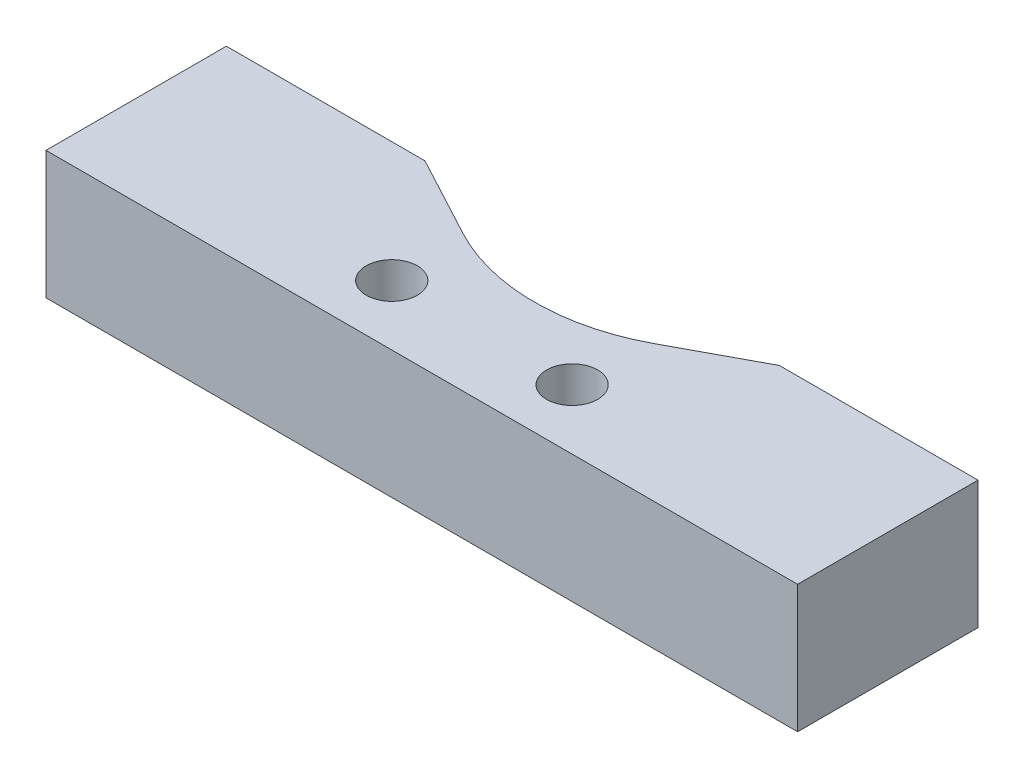
ISO-10303-21;
HEADER;
FILE_DESCRIPTION(('STEP AP214'),'2;1');
FILE_NAME('part.step','',(''),(''),'','','');
FILE_SCHEMA(('AUTOMOTIVE_DESIGN { 1 0 10303 214 1 1 1 1 }'));
ENDSEC;
DATA;
#1=APPLICATION_CONTEXT('core data for automotive mechanical design processes');
#2=APPLICATION_PROTOCOL_DEFINITION('international standard','automotive_design',2000,#1);
#3=PRODUCT_CONTEXT('',#1,'mechanical');
#4=PRODUCT('Part','Part','',(#3));
#5=PRODUCT_RELATED_PRODUCT_CATEGORY('part','',(#4));
#6=PRODUCT_DEFINITION_FORMATION('','',#4);
#7=PRODUCT_DEFINITION_CONTEXT('part definition',#1,'design');
#8=PRODUCT_DEFINITION('design','',#6,#7);
#9=PRODUCT_DEFINITION_SHAPE('','',#8);
#10=(LENGTH_UNIT() NAMED_UNIT(*) SI_UNIT(.MILLI.,.METRE.));
#11=(NAMED_UNIT(*) PLANE_ANGLE_UNIT() SI_UNIT($,.RADIAN.));
#12=(NAMED_UNIT(*) SI_UNIT($,.STERADIAN.) SOLID_ANGLE_UNIT());
#13=UNCERTAINTY_MEASURE_WITH_UNIT(LENGTH_MEASURE(1.E-05),#10,'distance_accuracy_value','');
#14=(GEOMETRIC_REPRESENTATION_CONTEXT(3) GLOBAL_UNCERTAINTY_ASSIGNED_CONTEXT((#13)) GLOBAL_UNIT_ASSIGNED_CONTEXT((#10,
#11,#12)) REPRESENTATION_CONTEXT('',''));
#15=CARTESIAN_POINT('',(0.,0.,0.));
#16=DIRECTION('',(0.,0.,1.));
#17=DIRECTION('',(1.,0.,0.));
#18=AXIS2_PLACEMENT_3D('',#15,#16,#17);
#19=CARTESIAN_POINT('',(6.37499999999999,8.5,11.8999737394668));
#20=DIRECTION('',(-0.472222222222222,0.,-0.881479536256802));
#21=DIRECTION('',(-0.881479536256802,0.,0.472222222222222));
#22=AXIS2_PLACEMENT_3D('',#19,#20,#21);
#23=PLANE('',#22);
#24=DIRECTION('',(0.881479536256802,0.,-0.472222222222222));
#25=VECTOR('',#24,1.);
#26=CARTESIAN_POINT('',(6.37499999999999,0.,11.8999737394668));
#27=LINE('',#26,#25);
#28=CARTESIAN_POINT('',(6.37499999999999,0.,11.8999737394668));
#29=VERTEX_POINT('',#28);
#30=CARTESIAN_POINT('',(11.7882723678115,0.,9.));
#31=VERTEX_POINT('',#30);
#32=EDGE_CURVE('E131',#29,#31,#27,.T.);
#33=ORIENTED_EDGE('',*,*,#32,.F.);
#34=DIRECTION('',(0.,-1.,0.));
#35=VECTOR('',#34,1.);
#36=CARTESIAN_POINT('',(6.37499999999999,8.5,11.8999737394668));
#37=LINE('',#36,#35);
#38=CARTESIAN_POINT('',(6.37499999999999,8.5,11.8999737394668));
#39=VERTEX_POINT('',#38);
#40=EDGE_CURVE('E11',#39,#29,#37,.T.);
#41=ORIENTED_EDGE('',*,*,#40,.F.);
#42=DIRECTION('',(0.881479536256802,0.,-0.472222222222222));
#43=VECTOR('',#42,1.);
#44=CARTESIAN_POINT('',(6.37499999999999,8.5,11.8999737394668));
#45=LINE('',#44,#43);
#46=CARTESIAN_POINT('',(11.7882723678115,8.5,9.));
#47=VERTEX_POINT('',#46);
#48=EDGE_CURVE('E151',#39,#47,#45,.T.);
#49=ORIENTED_EDGE('',*,*,#48,.T.);
#50=DIRECTION('',(0.,-1.,0.));
#51=VECTOR('',#50,1.);
#52=CARTESIAN_POINT('',(11.7882723678115,8.5,9.));
#53=LINE('',#52,#51);
#54=EDGE_CURVE('E89',#47,#31,#53,.T.);
#55=ORIENTED_EDGE('',*,*,#54,.T.);
#56=EDGE_LOOP('',(#33,#41,#49,#55));
#57=FACE_BOUND('',#56,.T.);
#58=ADVANCED_FACE('F38',(#57),#23,.T.);
#59=CARTESIAN_POINT('',(0.,8.5,0.));
#60=DIRECTION('',(0.,-1.,0.));
#61=DIRECTION('',(0.,0.,-1.));
#62=AXIS2_PLACEMENT_3D('',#59,#60,#61);
#63=CYLINDRICAL_SURFACE('',#62,13.5);
#64=CARTESIAN_POINT('',(0.,0.,0.));
#65=DIRECTION('',(0.,1.,0.));
#66=DIRECTION('',(0.,0.,1.));
#67=AXIS2_PLACEMENT_3D('',#64,#65,#66);
#68=CIRCLE('',#67,13.5);
#69=CARTESIAN_POINT('',(-6.37499999999999,0.,11.8999737394668));
#70=VERTEX_POINT('',#69);
#71=EDGE_CURVE('E134',#29,#70,#68,.F.);
#72=ORIENTED_EDGE('',*,*,#71,.T.);
#73=DIRECTION('',(0.,-1.,0.));
#74=VECTOR('',#73,1.);
#75=CARTESIAN_POINT('',(-6.37499999999999,8.5,11.8999737394668));
#76=LINE('',#75,#74);
#77=CARTESIAN_POINT('',(-6.37499999999999,8.5,11.8999737394668));
#78=VERTEX_POINT('',#77);
#79=EDGE_CURVE('E46',#78,#70,#76,.T.);
#80=ORIENTED_EDGE('',*,*,#79,.F.);
#81=CARTESIAN_POINT('',(0.,8.5,0.));
#82=DIRECTION('',(0.,1.,0.));
#83=DIRECTION('',(0.,0.,1.));
#84=AXIS2_PLACEMENT_3D('',#81,#82,#83);
#85=CIRCLE('',#84,13.5);
#86=EDGE_CURVE('E176',#39,#78,#85,.F.);
#87=ORIENTED_EDGE('',*,*,#86,.F.);
#88=ORIENTED_EDGE('',*,*,#40,.T.);
#89=EDGE_LOOP('',(#72,#80,#87,#88));
#90=FACE_BOUND('',#89,.T.);
#91=ADVANCED_FACE('F167',(#90),#63,.F.);
#92=CARTESIAN_POINT('',(-6.37499999999999,8.5,11.8999737394668));
#93=DIRECTION('',(0.472222222222222,0.,-0.881479536256802));
#94=DIRECTION('',(-0.881479536256802,0.,-0.472222222222222));
#95=AXIS2_PLACEMENT_3D('',#92,#93,#94);
#96=PLANE('',#95);
#97=DIRECTION('',(0.881479536256802,0.,0.472222222222222));
#98=VECTOR('',#97,1.);
#99=CARTESIAN_POINT('',(-6.37499999999999,0.,11.8999737394668));
#100=LINE('',#99,#98);
#101=CARTESIAN_POINT('',(-11.7882723678115,0.,9.00000000000001));
#102=VERTEX_POINT('',#101);
#103=EDGE_CURVE('E138',#102,#70,#100,.T.);
#104=ORIENTED_EDGE('',*,*,#103,.F.);
#105=DIRECTION('',(0.,-1.,0.));
#106=VECTOR('',#105,1.);
#107=CARTESIAN_POINT('',(-11.7882723678115,8.5,9.00000000000001));
#108=LINE('',#107,#106);
#109=CARTESIAN_POINT('',(-11.7882723678115,8.5,9.00000000000001));
#110=VERTEX_POINT('',#109);
#111=EDGE_CURVE('E157',#110,#102,#108,.T.);
#112=ORIENTED_EDGE('',*,*,#111,.F.);
#113=DIRECTION('',(0.881479536256802,0.,0.472222222222222));
#114=VECTOR('',#113,1.);
#115=CARTESIAN_POINT('',(-6.37499999999999,8.5,11.8999737394668));
#116=LINE('',#115,#114);
#117=EDGE_CURVE('E164',#110,#78,#116,.T.);
#118=ORIENTED_EDGE('',*,*,#117,.T.);
#119=ORIENTED_EDGE('',*,*,#79,.T.);
#120=EDGE_LOOP('',(#104,#112,#118,#119));
#121=FACE_BOUND('',#120,.T.);
#122=ADVANCED_FACE('F162',(#121),#96,.T.);
#123=CARTESIAN_POINT('',(0.,8.5,9.00000000000001));
#124=DIRECTION('',(0.,0.,-1.));
#125=DIRECTION('',(-1.,0.,0.));
#126=AXIS2_PLACEMENT_3D('',#123,#124,#125);
#127=PLANE('',#126);
#128=DIRECTION('',(1.,0.,0.));
#129=VECTOR('',#128,1.);
#130=CARTESIAN_POINT('',(0.,0.,9.00000000000001));
#131=LINE('',#130,#129);
#132=CARTESIAN_POINT('',(-25.,0.,9.00000000000001));
#133=VERTEX_POINT('',#132);
#134=EDGE_CURVE('E141',#133,#102,#131,.T.);
#135=ORIENTED_EDGE('',*,*,#134,.F.);
#136=DIRECTION('',(0.,-1.,0.));
#137=VECTOR('',#136,1.);
#138=CARTESIAN_POINT('',(-25.,8.5,9.00000000000001));
#139=LINE('',#138,#137);
#140=CARTESIAN_POINT('',(-25.,8.5,9.00000000000001));
#141=VERTEX_POINT('',#140);
#142=EDGE_CURVE('E155',#141,#133,#139,.T.);
#143=ORIENTED_EDGE('',*,*,#142,.F.);
#144=DIRECTION('',(1.,0.,0.));
#145=VECTOR('',#144,1.);
#146=CARTESIAN_POINT('',(0.,8.5,9.00000000000001));
#147=LINE('',#146,#145);
#148=EDGE_CURVE('E175',#141,#110,#147,.T.);
#149=ORIENTED_EDGE('',*,*,#148,.T.);
#150=ORIENTED_EDGE('',*,*,#111,.T.);
#151=EDGE_LOOP('',(#135,#143,#149,#150));
#152=FACE_BOUND('',#151,.T.);
#153=ADVANCED_FACE('F173',(#152),#127,.T.);
#154=CARTESIAN_POINT('',(-25.,8.5,0.));
#155=DIRECTION('',(-1.,0.,0.));
#156=DIRECTION('',(0.,0.,1.));
#157=AXIS2_PLACEMENT_3D('',#154,#155,#156);
#158=PLANE('',#157);
#159=DIRECTION('',(0.,0.,-1.));
#160=VECTOR('',#159,1.);
#161=CARTESIAN_POINT('',(-25.,0.,0.));
#162=LINE('',#161,#160);
#163=CARTESIAN_POINT('',(-25.,0.,21.));
#164=VERTEX_POINT('',#163);
#165=EDGE_CURVE('E144',#164,#133,#162,.T.);
#166=ORIENTED_EDGE('',*,*,#165,.F.);
#167=DIRECTION('',(0.,-1.,0.));
#168=VECTOR('',#167,1.);
#169=CARTESIAN_POINT('',(-25.,8.5,21.));
#170=LINE('',#169,#168);
#171=CARTESIAN_POINT('',(-25.,8.5,21.));
#172=VERTEX_POINT('',#171);
#173=EDGE_CURVE('E123',#172,#164,#170,.T.);
#174=ORIENTED_EDGE('',*,*,#173,.F.);
#175=DIRECTION('',(0.,0.,-1.));
#176=VECTOR('',#175,1.);
#177=CARTESIAN_POINT('',(-25.,8.5,0.));
#178=LINE('',#177,#176);
#179=EDGE_CURVE('E116',#172,#141,#178,.T.);
#180=ORIENTED_EDGE('',*,*,#179,.T.);
#181=ORIENTED_EDGE('',*,*,#142,.T.);
#182=EDGE_LOOP('',(#166,#174,#180,#181));
#183=FACE_BOUND('',#182,.T.);
#184=ADVANCED_FACE('F182',(#183),#158,.T.);
#185=CARTESIAN_POINT('',(0.,8.5,21.));
#186=DIRECTION('',(0.,0.,-1.));
#187=DIRECTION('',(-1.,0.,0.));
#188=AXIS2_PLACEMENT_3D('',#185,#186,#187);
#189=PLANE('',#188);
#190=DIRECTION('',(1.,0.,0.));
#191=VECTOR('',#190,1.);
#192=CARTESIAN_POINT('',(0.,0.,21.));
#193=LINE('',#192,#191);
#194=CARTESIAN_POINT('',(25.,0.,21.));
#195=VERTEX_POINT('',#194);
#196=EDGE_CURVE('E122',#164,#195,#193,.T.);
#197=ORIENTED_EDGE('',*,*,#196,.T.);
#198=DIRECTION('',(0.,-1.,0.));
#199=VECTOR('',#198,1.);
#200=CARTESIAN_POINT('',(25.,8.5,21.));
#201=LINE('',#200,#199);
#202=CARTESIAN_POINT('',(25.,8.5,21.));
#203=VERTEX_POINT('',#202);
#204=EDGE_CURVE('E119',#203,#195,#201,.T.);
#205=ORIENTED_EDGE('',*,*,#204,.F.);
#206=DIRECTION('',(1.,0.,0.));
#207=VECTOR('',#206,1.);
#208=CARTESIAN_POINT('',(0.,8.5,21.));
#209=LINE('',#208,#207);
#210=EDGE_CURVE('E109',#172,#203,#209,.T.);
#211=ORIENTED_EDGE('',*,*,#210,.F.);
#212=ORIENTED_EDGE('',*,*,#173,.T.);
#213=EDGE_LOOP('',(#197,#205,#211,#212));
#214=FACE_BOUND('',#213,.T.);
#215=ADVANCED_FACE('F120',(#214),#189,.F.);
#216=CARTESIAN_POINT('',(25.,8.5,0.));
#217=DIRECTION('',(-1.,0.,0.));
#218=DIRECTION('',(0.,0.,1.));
#219=AXIS2_PLACEMENT_3D('',#216,#217,#218);
#220=PLANE('',#219);
#221=DIRECTION('',(0.,0.,-1.));
#222=VECTOR('',#221,1.);
#223=CARTESIAN_POINT('',(25.,0.,0.));
#224=LINE('',#223,#222);
#225=CARTESIAN_POINT('',(25.,0.,9.));
#226=VERTEX_POINT('',#225);
#227=EDGE_CURVE('E82',#195,#226,#224,.T.);
#228=ORIENTED_EDGE('',*,*,#227,.T.);
#229=DIRECTION('',(0.,-1.,0.));
#230=VECTOR('',#229,1.);
#231=CARTESIAN_POINT('',(25.,8.5,9.));
#232=LINE('',#231,#230);
#233=CARTESIAN_POINT('',(25.,8.5,9.));
#234=VERTEX_POINT('',#233);
#235=EDGE_CURVE('E124',#234,#226,#232,.T.);
#236=ORIENTED_EDGE('',*,*,#235,.F.);
#237=DIRECTION('',(0.,0.,-1.));
#238=VECTOR('',#237,1.);
#239=CARTESIAN_POINT('',(25.,8.5,0.));
#240=LINE('',#239,#238);
#241=EDGE_CURVE('E113',#203,#234,#240,.T.);
#242=ORIENTED_EDGE('',*,*,#241,.F.);
#243=ORIENTED_EDGE('',*,*,#204,.T.);
#244=EDGE_LOOP('',(#228,#236,#242,#243));
#245=FACE_BOUND('',#244,.T.);
#246=ADVANCED_FACE('F126',(#245),#220,.F.);
#247=CARTESIAN_POINT('',(0.,8.5,9.00000000000001));
#248=DIRECTION('',(0.,0.,1.));
#249=DIRECTION('',(1.,0.,0.));
#250=AXIS2_PLACEMENT_3D('',#247,#248,#249);
#251=PLANE('',#250);
#252=DIRECTION('',(-1.,0.,0.));
#253=VECTOR('',#252,1.);
#254=CARTESIAN_POINT('',(0.,0.,9.00000000000001));
#255=LINE('',#254,#253);
#256=EDGE_CURVE('E149',#226,#31,#255,.T.);
#257=ORIENTED_EDGE('',*,*,#256,.T.);
#258=ORIENTED_EDGE('',*,*,#54,.F.);
#259=DIRECTION('',(-1.,0.,0.));
#260=VECTOR('',#259,1.);
#261=CARTESIAN_POINT('',(0.,8.5,9.00000000000001));
#262=LINE('',#261,#260);
#263=EDGE_CURVE('E54',#234,#47,#262,.T.);
#264=ORIENTED_EDGE('',*,*,#263,.F.);
#265=ORIENTED_EDGE('',*,*,#235,.T.);
#266=EDGE_LOOP('',(#257,#258,#264,#265));
#267=FACE_BOUND('',#266,.T.);
#268=ADVANCED_FACE('F185',(#267),#251,.F.);
#269=CARTESIAN_POINT('',(0.,8.5,0.));
#270=DIRECTION('',(0.,1.,0.));
#271=DIRECTION('',(0.,0.,1.));
#272=AXIS2_PLACEMENT_3D('',#269,#270,#271);
#273=PLANE('',#272);
#274=CARTESIAN_POINT('',(6.,8.5,17.));
#275=DIRECTION('',(0.,1.,0.));
#276=DIRECTION('',(0.,0.,1.));
#277=AXIS2_PLACEMENT_3D('',#274,#275,#276);
#278=CIRCLE('',#277,1.7);
#279=CARTESIAN_POINT('',(6.,8.5,18.7));
#280=VERTEX_POINT('',#279);
#281=EDGE_CURVE('E193',#280,#280,#278,.T.);
#282=ORIENTED_EDGE('',*,*,#281,.F.);
#283=EDGE_LOOP('',(#282));
#284=FACE_BOUND('',#283,.T.);
#285=CARTESIAN_POINT('',(-6.,8.5,17.));
#286=DIRECTION('',(0.,1.,0.));
#287=DIRECTION('',(0.,0.,-1.));
#288=AXIS2_PLACEMENT_3D('',#285,#286,#287);
#289=CIRCLE('',#288,1.7);
#290=CARTESIAN_POINT('',(-6.,8.5,15.3));
#291=VERTEX_POINT('',#290);
#292=EDGE_CURVE('E187',#291,#291,#289,.T.);
#293=ORIENTED_EDGE('',*,*,#292,.F.);
#294=EDGE_LOOP('',(#293));
#295=FACE_BOUND('',#294,.T.);
#296=ORIENTED_EDGE('',*,*,#48,.F.);
#297=ORIENTED_EDGE('',*,*,#86,.T.);
#298=ORIENTED_EDGE('',*,*,#117,.F.);
#299=ORIENTED_EDGE('',*,*,#148,.F.);
#300=ORIENTED_EDGE('',*,*,#179,.F.);
#301=ORIENTED_EDGE('',*,*,#210,.T.);
#302=ORIENTED_EDGE('',*,*,#241,.T.);
#303=ORIENTED_EDGE('',*,*,#263,.T.);
#304=EDGE_LOOP('',(#296,#297,#298,#299,#300,#301,#302,#303));
#305=FACE_BOUND('',#304,.T.);
#306=ADVANCED_FACE('F111',(#284,#295,#305),#273,.T.);
#307=CARTESIAN_POINT('',(0.,0.,0.));
#308=DIRECTION('',(0.,1.,0.));
#309=DIRECTION('',(0.,0.,1.));
#310=AXIS2_PLACEMENT_3D('',#307,#308,#309);
#311=PLANE('',#310);
#312=CARTESIAN_POINT('',(6.,0.,17.));
#313=DIRECTION('',(0.,1.,0.));
#314=DIRECTION('',(0.,0.,1.));
#315=AXIS2_PLACEMENT_3D('',#312,#313,#314);
#316=CIRCLE('',#315,1.7);
#317=CARTESIAN_POINT('',(6.,0.,18.7));
#318=VERTEX_POINT('',#317);
#319=EDGE_CURVE('E135',#318,#318,#316,.T.);
#320=ORIENTED_EDGE('',*,*,#319,.T.);
#321=EDGE_LOOP('',(#320));
#322=FACE_BOUND('',#321,.T.);
#323=CARTESIAN_POINT('',(-6.,0.,17.));
#324=DIRECTION('',(0.,1.,0.));
#325=DIRECTION('',(0.,0.,-1.));
#326=AXIS2_PLACEMENT_3D('',#323,#324,#325);
#327=CIRCLE('',#326,1.7);
#328=CARTESIAN_POINT('',(-6.,0.,15.3));
#329=VERTEX_POINT('',#328);
#330=EDGE_CURVE('E190',#329,#329,#327,.T.);
#331=ORIENTED_EDGE('',*,*,#330,.T.);
#332=EDGE_LOOP('',(#331));
#333=FACE_BOUND('',#332,.T.);
#334=ORIENTED_EDGE('',*,*,#32,.T.);
#335=ORIENTED_EDGE('',*,*,#256,.F.);
#336=ORIENTED_EDGE('',*,*,#227,.F.);
#337=ORIENTED_EDGE('',*,*,#196,.F.);
#338=ORIENTED_EDGE('',*,*,#165,.T.);
#339=ORIENTED_EDGE('',*,*,#134,.T.);
#340=ORIENTED_EDGE('',*,*,#103,.T.);
#341=ORIENTED_EDGE('',*,*,#71,.F.);
#342=EDGE_LOOP('',(#334,#335,#336,#337,#338,#339,#340,#341));
#343=FACE_BOUND('',#342,.T.);
#344=ADVANCED_FACE('F169',(#322,#333,#343),#311,.F.);
#345=CARTESIAN_POINT('',(-6.,0.,17.));
#346=DIRECTION('',(0.,1.,0.));
#347=DIRECTION('',(0.,0.,1.));
#348=AXIS2_PLACEMENT_3D('',#345,#346,#347);
#349=CYLINDRICAL_SURFACE('',#348,1.7);
#350=ORIENTED_EDGE('',*,*,#330,.F.);
#351=EDGE_LOOP('',(#350));
#352=FACE_BOUND('',#351,.T.);
#353=ORIENTED_EDGE('',*,*,#292,.T.);
#354=EDGE_LOOP('',(#353));
#355=FACE_BOUND('',#354,.T.);
#356=ADVANCED_FACE('F204',(#352,#355),#349,.F.);
#357=CARTESIAN_POINT('',(6.,0.,17.));
#358=DIRECTION('',(0.,1.,0.));
#359=DIRECTION('',(0.,0.,1.));
#360=AXIS2_PLACEMENT_3D('',#357,#358,#359);
#361=CYLINDRICAL_SURFACE('',#360,1.7);
#362=ORIENTED_EDGE('',*,*,#319,.F.);
#363=EDGE_LOOP('',(#362));
#364=FACE_BOUND('',#363,.T.);
#365=ORIENTED_EDGE('',*,*,#281,.T.);
#366=EDGE_LOOP('',(#365));
#367=FACE_BOUND('',#366,.T.);
#368=ADVANCED_FACE('F201',(#364,#367),#361,.F.);
#369=CLOSED_SHELL('',(#58,#91,#122,#153,#184,#215,#246,#268,#306,#344,#356,#368));
#370=MANIFOLD_SOLID_BREP('B2',#369);
#371=ADVANCED_BREP_SHAPE_REPRESENTATION('',(#18,#370),#14);
#372=SHAPE_DEFINITION_REPRESENTATION(#9,#371);
ENDSEC;
END-ISO-10303-21;
